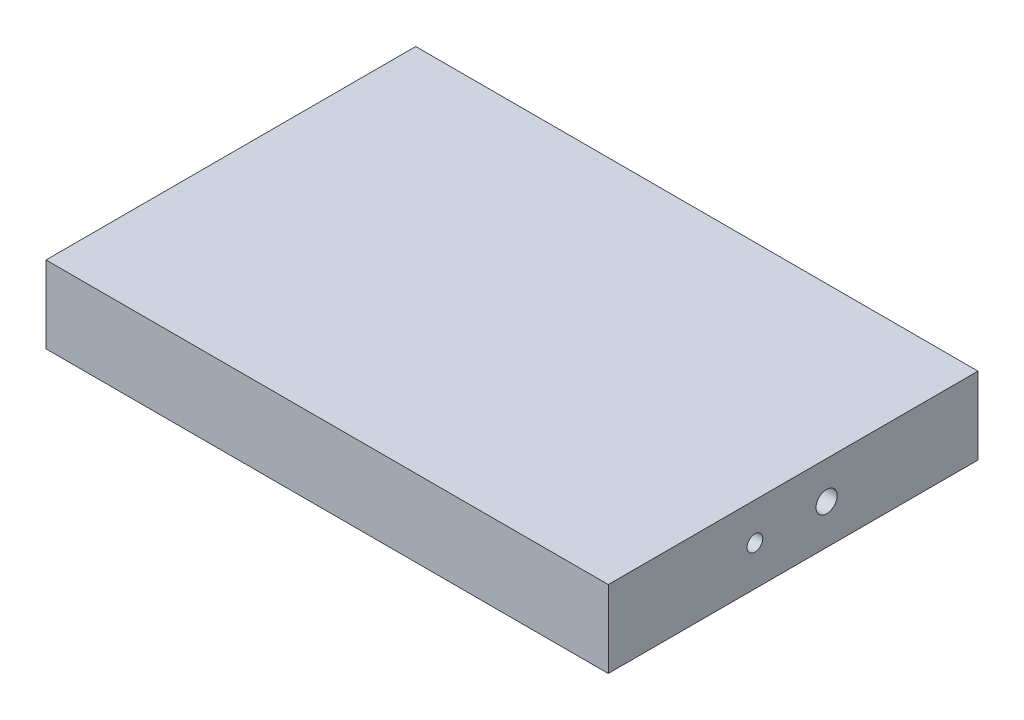
ISO-10303-21;
HEADER;
FILE_DESCRIPTION(('STEP AP214'),'2;1');
FILE_NAME('part.step','',(''),(''),'','','');
FILE_SCHEMA(('AUTOMOTIVE_DESIGN { 1 0 10303 214 1 1 1 1 }'));
ENDSEC;
DATA;
#1=APPLICATION_CONTEXT('core data for automotive mechanical design processes');
#2=APPLICATION_PROTOCOL_DEFINITION('international standard','automotive_design',2000,#1);
#3=PRODUCT_CONTEXT('',#1,'mechanical');
#4=PRODUCT('Part','Part','',(#3));
#5=PRODUCT_RELATED_PRODUCT_CATEGORY('part','',(#4));
#6=PRODUCT_DEFINITION_FORMATION('','',#4);
#7=PRODUCT_DEFINITION_CONTEXT('part definition',#1,'design');
#8=PRODUCT_DEFINITION('design','',#6,#7);
#9=PRODUCT_DEFINITION_SHAPE('','',#8);
#10=(LENGTH_UNIT() NAMED_UNIT(*) SI_UNIT(.MILLI.,.METRE.));
#11=(NAMED_UNIT(*) PLANE_ANGLE_UNIT() SI_UNIT($,.RADIAN.));
#12=(NAMED_UNIT(*) SI_UNIT($,.STERADIAN.) SOLID_ANGLE_UNIT());
#13=UNCERTAINTY_MEASURE_WITH_UNIT(LENGTH_MEASURE(1.E-05),#10,'distance_accuracy_value','');
#14=(GEOMETRIC_REPRESENTATION_CONTEXT(3) GLOBAL_UNCERTAINTY_ASSIGNED_CONTEXT((#13)) GLOBAL_UNIT_ASSIGNED_CONTEXT((#10,
#11,#12)) REPRESENTATION_CONTEXT('',''));
#15=CARTESIAN_POINT('',(0.,0.,0.));
#16=DIRECTION('',(0.,0.,1.));
#17=DIRECTION('',(1.,0.,0.));
#18=AXIS2_PLACEMENT_3D('',#15,#16,#17);
#19=CARTESIAN_POINT('',(0.,5.,0.));
#20=DIRECTION('',(1.,0.,0.));
#21=DIRECTION('',(0.,0.,-1.));
#22=AXIS2_PLACEMENT_3D('',#19,#20,#21);
#23=PLANE('',#22);
#24=DIRECTION('',(0.,0.,1.));
#25=VECTOR('',#24,1.);
#26=CARTESIAN_POINT('',(0.,0.,0.));
#27=LINE('',#26,#25);
#28=CARTESIAN_POINT('',(0.,0.,-24.));
#29=VERTEX_POINT('',#28);
#30=CARTESIAN_POINT('',(0.,0.,0.));
#31=VERTEX_POINT('',#30);
#32=EDGE_CURVE('E96',#29,#31,#27,.T.);
#33=ORIENTED_EDGE('',*,*,#32,.T.);
#34=DIRECTION('',(0.,-1.,0.));
#35=VECTOR('',#34,1.);
#36=CARTESIAN_POINT('',(0.,5.,0.));
#37=LINE('',#36,#35);
#38=CARTESIAN_POINT('',(0.,5.,0.));
#39=VERTEX_POINT('',#38);
#40=EDGE_CURVE('E11',#39,#31,#37,.T.);
#41=ORIENTED_EDGE('',*,*,#40,.F.);
#42=DIRECTION('',(0.,0.,1.));
#43=VECTOR('',#42,1.);
#44=CARTESIAN_POINT('',(0.,5.,0.));
#45=LINE('',#44,#43);
#46=CARTESIAN_POINT('',(0.,5.,-24.));
#47=VERTEX_POINT('',#46);
#48=EDGE_CURVE('E84',#47,#39,#45,.T.);
#49=ORIENTED_EDGE('',*,*,#48,.F.);
#50=DIRECTION('',(0.,-1.,0.));
#51=VECTOR('',#50,1.);
#52=CARTESIAN_POINT('',(0.,5.,-24.));
#53=LINE('',#52,#51);
#54=EDGE_CURVE('E92',#47,#29,#53,.T.);
#55=ORIENTED_EDGE('',*,*,#54,.T.);
#56=EDGE_LOOP('',(#33,#41,#49,#55));
#57=FACE_BOUND('',#56,.T.);
#58=ADVANCED_FACE('F33',(#57),#23,.F.);
#59=CARTESIAN_POINT('',(0.,5.,0.));
#60=DIRECTION('',(0.,0.,-1.));
#61=DIRECTION('',(-1.,0.,0.));
#62=AXIS2_PLACEMENT_3D('',#59,#60,#61);
#63=PLANE('',#62);
#64=DIRECTION('',(1.,0.,0.));
#65=VECTOR('',#64,1.);
#66=CARTESIAN_POINT('',(0.,0.,0.));
#67=LINE('',#66,#65);
#68=CARTESIAN_POINT('',(36.5,0.,0.));
#69=VERTEX_POINT('',#68);
#70=EDGE_CURVE('E88',#31,#69,#67,.T.);
#71=ORIENTED_EDGE('',*,*,#70,.T.);
#72=DIRECTION('',(0.,-1.,0.));
#73=VECTOR('',#72,1.);
#74=CARTESIAN_POINT('',(36.5,5.,0.));
#75=LINE('',#74,#73);
#76=CARTESIAN_POINT('',(36.5,5.,0.));
#77=VERTEX_POINT('',#76);
#78=EDGE_CURVE('E41',#77,#69,#75,.T.);
#79=ORIENTED_EDGE('',*,*,#78,.F.);
#80=DIRECTION('',(1.,0.,0.));
#81=VECTOR('',#80,1.);
#82=CARTESIAN_POINT('',(0.,5.,0.));
#83=LINE('',#82,#81);
#84=EDGE_CURVE('E79',#39,#77,#83,.T.);
#85=ORIENTED_EDGE('',*,*,#84,.F.);
#86=ORIENTED_EDGE('',*,*,#40,.T.);
#87=EDGE_LOOP('',(#71,#79,#85,#86));
#88=FACE_BOUND('',#87,.T.);
#89=ADVANCED_FACE('F87',(#88),#63,.F.);
#90=CARTESIAN_POINT('',(36.5,5.,0.));
#91=DIRECTION('',(-1.,0.,0.));
#92=DIRECTION('',(0.,0.,1.));
#93=AXIS2_PLACEMENT_3D('',#90,#91,#92);
#94=PLANE('',#93);
#95=CARTESIAN_POINT('',(36.5,2.57970395673226,-14.170102921947));
#96=DIRECTION('',(1.,0.,0.));
#97=DIRECTION('',(0.,0.,-1.));
#98=AXIS2_PLACEMENT_3D('',#95,#96,#97);
#99=CIRCLE('',#98,0.684048874234519);
#100=CARTESIAN_POINT('',(36.5,2.57970395673226,-14.8541517961816));
#101=VERTEX_POINT('',#100);
#102=EDGE_CURVE('E116',#101,#101,#99,.T.);
#103=ORIENTED_EDGE('',*,*,#102,.F.);
#104=EDGE_LOOP('',(#103));
#105=FACE_BOUND('',#104,.T.);
#106=CARTESIAN_POINT('',(36.5,2.57970395673226,-9.51821713270708));
#107=DIRECTION('',(1.,0.,0.));
#108=DIRECTION('',(0.,0.,-1.));
#109=AXIS2_PLACEMENT_3D('',#106,#107,#108);
#110=CIRCLE('',#109,0.511749616948345);
#111=CARTESIAN_POINT('',(36.5,2.57970395673226,-10.0299667496554));
#112=VERTEX_POINT('',#111);
#113=EDGE_CURVE('E110',#112,#112,#110,.T.);
#114=ORIENTED_EDGE('',*,*,#113,.F.);
#115=EDGE_LOOP('',(#114));
#116=FACE_BOUND('',#115,.T.);
#117=DIRECTION('',(0.,0.,-1.));
#118=VECTOR('',#117,1.);
#119=CARTESIAN_POINT('',(36.5,0.,0.));
#120=LINE('',#119,#118);
#121=CARTESIAN_POINT('',(36.5,0.,-24.));
#122=VERTEX_POINT('',#121);
#123=EDGE_CURVE('E66',#69,#122,#120,.T.);
#124=ORIENTED_EDGE('',*,*,#123,.T.);
#125=DIRECTION('',(0.,-1.,0.));
#126=VECTOR('',#125,1.);
#127=CARTESIAN_POINT('',(36.5,5.,-24.));
#128=LINE('',#127,#126);
#129=CARTESIAN_POINT('',(36.5,5.,-24.));
#130=VERTEX_POINT('',#129);
#131=EDGE_CURVE('E89',#130,#122,#128,.T.);
#132=ORIENTED_EDGE('',*,*,#131,.F.);
#133=DIRECTION('',(0.,0.,-1.));
#134=VECTOR('',#133,1.);
#135=CARTESIAN_POINT('',(36.5,5.,0.));
#136=LINE('',#135,#134);
#137=EDGE_CURVE('E82',#77,#130,#136,.T.);
#138=ORIENTED_EDGE('',*,*,#137,.F.);
#139=ORIENTED_EDGE('',*,*,#78,.T.);
#140=EDGE_LOOP('',(#124,#132,#138,#139));
#141=FACE_BOUND('',#140,.T.);
#142=ADVANCED_FACE('F90',(#105,#116,#141),#94,.F.);
#143=CARTESIAN_POINT('',(0.,5.,-24.));
#144=DIRECTION('',(0.,0.,1.));
#145=DIRECTION('',(1.,0.,0.));
#146=AXIS2_PLACEMENT_3D('',#143,#144,#145);
#147=PLANE('',#146);
#148=DIRECTION('',(-1.,0.,0.));
#149=VECTOR('',#148,1.);
#150=CARTESIAN_POINT('',(0.,0.,-24.));
#151=LINE('',#150,#149);
#152=EDGE_CURVE('E72',#122,#29,#151,.T.);
#153=ORIENTED_EDGE('',*,*,#152,.T.);
#154=ORIENTED_EDGE('',*,*,#54,.F.);
#155=DIRECTION('',(-1.,0.,0.));
#156=VECTOR('',#155,1.);
#157=CARTESIAN_POINT('',(0.,5.,-24.));
#158=LINE('',#157,#156);
#159=EDGE_CURVE('E49',#130,#47,#158,.T.);
#160=ORIENTED_EDGE('',*,*,#159,.F.);
#161=ORIENTED_EDGE('',*,*,#131,.T.);
#162=EDGE_LOOP('',(#153,#154,#160,#161));
#163=FACE_BOUND('',#162,.T.);
#164=ADVANCED_FACE('F104',(#163),#147,.F.);
#165=CARTESIAN_POINT('',(0.,5.,0.));
#166=DIRECTION('',(0.,-1.,0.));
#167=DIRECTION('',(0.,0.,-1.));
#168=AXIS2_PLACEMENT_3D('',#165,#166,#167);
#169=PLANE('',#168);
#170=ORIENTED_EDGE('',*,*,#48,.T.);
#171=ORIENTED_EDGE('',*,*,#84,.T.);
#172=ORIENTED_EDGE('',*,*,#137,.T.);
#173=ORIENTED_EDGE('',*,*,#159,.T.);
#174=EDGE_LOOP('',(#170,#171,#172,#173));
#175=FACE_BOUND('',#174,.T.);
#176=ADVANCED_FACE('F80',(#175),#169,.F.);
#177=CARTESIAN_POINT('',(0.,0.,0.));
#178=DIRECTION('',(0.,-1.,0.));
#179=DIRECTION('',(0.,0.,-1.));
#180=AXIS2_PLACEMENT_3D('',#177,#178,#179);
#181=PLANE('',#180);
#182=ORIENTED_EDGE('',*,*,#32,.F.);
#183=ORIENTED_EDGE('',*,*,#152,.F.);
#184=ORIENTED_EDGE('',*,*,#123,.F.);
#185=ORIENTED_EDGE('',*,*,#70,.F.);
#186=EDGE_LOOP('',(#182,#183,#184,#185));
#187=FACE_BOUND('',#186,.T.);
#188=ADVANCED_FACE('F107',(#187),#181,.T.);
#189=CARTESIAN_POINT('',(31.,2.57970395673226,-9.51821713270708));
#190=DIRECTION('',(1.,0.,0.));
#191=DIRECTION('',(0.,0.,-1.));
#192=AXIS2_PLACEMENT_3D('',#189,#190,#191);
#193=CYLINDRICAL_SURFACE('',#192,0.511749616948345);
#194=CARTESIAN_POINT('',(31.,2.57970395673226,-9.51821713270708));
#195=DIRECTION('',(1.,0.,0.));
#196=DIRECTION('',(0.,0.,-1.));
#197=AXIS2_PLACEMENT_3D('',#194,#195,#196);
#198=CIRCLE('',#197,0.511749616948345);
#199=CARTESIAN_POINT('',(31.,2.57970395673226,-10.0299667496554));
#200=VERTEX_POINT('',#199);
#201=EDGE_CURVE('E99',#200,#200,#198,.T.);
#202=ORIENTED_EDGE('',*,*,#201,.F.);
#203=EDGE_LOOP('',(#202));
#204=FACE_BOUND('',#203,.T.);
#205=ORIENTED_EDGE('',*,*,#113,.T.);
#206=EDGE_LOOP('',(#205));
#207=FACE_BOUND('',#206,.T.);
#208=ADVANCED_FACE('F136',(#204,#207),#193,.F.);
#209=CARTESIAN_POINT('',(31.,2.57970395673226,-9.51821713270708));
#210=DIRECTION('',(1.,0.,0.));
#211=DIRECTION('',(0.,0.,-1.));
#212=AXIS2_PLACEMENT_3D('',#209,#210,#211);
#213=PLANE('',#212);
#214=ORIENTED_EDGE('',*,*,#201,.T.);
#215=EDGE_LOOP('',(#214));
#216=FACE_BOUND('',#215,.T.);
#217=ADVANCED_FACE('F127',(#216),#213,.T.);
#218=CARTESIAN_POINT('',(31.,2.57970395673226,-14.170102921947));
#219=DIRECTION('',(1.,0.,0.));
#220=DIRECTION('',(0.,0.,-1.));
#221=AXIS2_PLACEMENT_3D('',#218,#219,#220);
#222=CYLINDRICAL_SURFACE('',#221,0.684048874234519);
#223=CARTESIAN_POINT('',(31.,2.57970395673226,-14.170102921947));
#224=DIRECTION('',(1.,0.,0.));
#225=DIRECTION('',(0.,0.,-1.));
#226=AXIS2_PLACEMENT_3D('',#223,#224,#225);
#227=CIRCLE('',#226,0.684048874234519);
#228=CARTESIAN_POINT('',(31.,2.57970395673226,-14.8541517961816));
#229=VERTEX_POINT('',#228);
#230=EDGE_CURVE('E113',#229,#229,#227,.T.);
#231=ORIENTED_EDGE('',*,*,#230,.F.);
#232=EDGE_LOOP('',(#231));
#233=FACE_BOUND('',#232,.T.);
#234=ORIENTED_EDGE('',*,*,#102,.T.);
#235=EDGE_LOOP('',(#234));
#236=FACE_BOUND('',#235,.T.);
#237=ADVANCED_FACE('F124',(#233,#236),#222,.F.);
#238=CARTESIAN_POINT('',(31.,2.57970395673226,-14.170102921947));
#239=DIRECTION('',(1.,0.,0.));
#240=DIRECTION('',(0.,0.,-1.));
#241=AXIS2_PLACEMENT_3D('',#238,#239,#240);
#242=PLANE('',#241);
#243=ORIENTED_EDGE('',*,*,#230,.T.);
#244=EDGE_LOOP('',(#243));
#245=FACE_BOUND('',#244,.T.);
#246=ADVANCED_FACE('F122',(#245),#242,.T.);
#247=CLOSED_SHELL('',(#58,#89,#142,#164,#176,#188,#208,#217,#237,#246));
#248=MANIFOLD_SOLID_BREP('B2',#247);
#249=ADVANCED_BREP_SHAPE_REPRESENTATION('',(#18,#248),#14);
#250=SHAPE_DEFINITION_REPRESENTATION(#9,#249);
ENDSEC;
END-ISO-10303-21;
